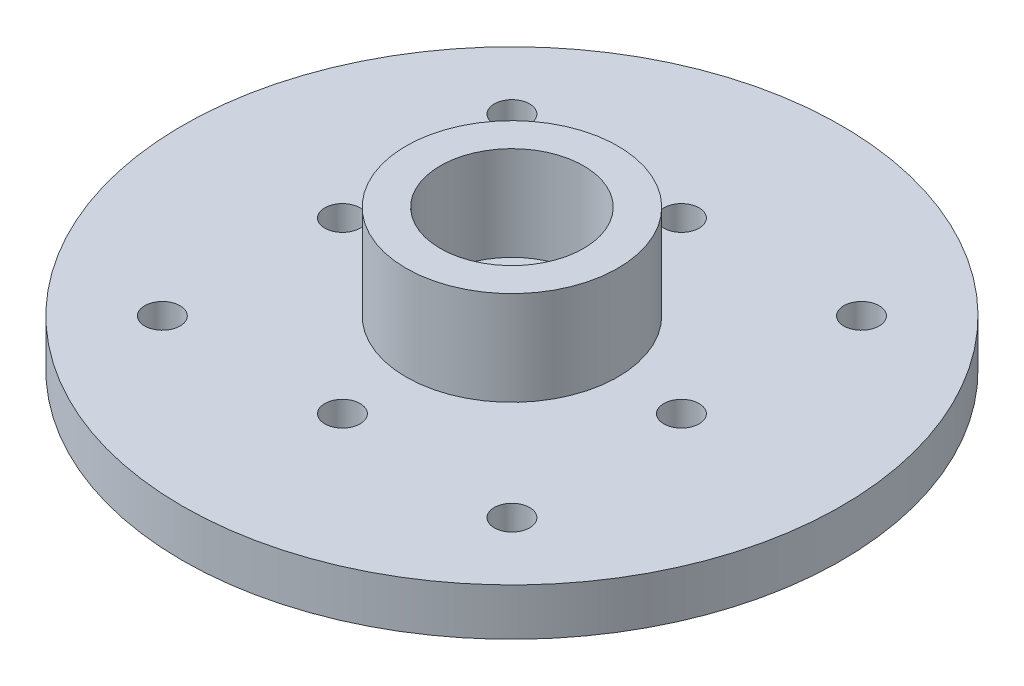
ISO-10303-21;
HEADER;
FILE_DESCRIPTION(('STEP AP214'),'2;1');
FILE_NAME('part.step','',(''),(''),'','','');
FILE_SCHEMA(('AUTOMOTIVE_DESIGN { 1 0 10303 214 1 1 1 1 }'));
ENDSEC;
DATA;
#1=APPLICATION_CONTEXT('core data for automotive mechanical design processes');
#2=APPLICATION_PROTOCOL_DEFINITION('international standard','automotive_design',2000,#1);
#3=PRODUCT_CONTEXT('',#1,'mechanical');
#4=PRODUCT('Part','Part','',(#3));
#5=PRODUCT_RELATED_PRODUCT_CATEGORY('part','',(#4));
#6=PRODUCT_DEFINITION_FORMATION('','',#4);
#7=PRODUCT_DEFINITION_CONTEXT('part definition',#1,'design');
#8=PRODUCT_DEFINITION('design','',#6,#7);
#9=PRODUCT_DEFINITION_SHAPE('','',#8);
#10=(LENGTH_UNIT() NAMED_UNIT(*) SI_UNIT(.MILLI.,.METRE.));
#11=(NAMED_UNIT(*) PLANE_ANGLE_UNIT() SI_UNIT($,.RADIAN.));
#12=(NAMED_UNIT(*) SI_UNIT($,.STERADIAN.) SOLID_ANGLE_UNIT());
#13=UNCERTAINTY_MEASURE_WITH_UNIT(LENGTH_MEASURE(1.E-05),#10,'distance_accuracy_value','');
#14=(GEOMETRIC_REPRESENTATION_CONTEXT(3) GLOBAL_UNCERTAINTY_ASSIGNED_CONTEXT((#13)) GLOBAL_UNIT_ASSIGNED_CONTEXT((#10,
#11,#12)) REPRESENTATION_CONTEXT('',''));
#15=CARTESIAN_POINT('',(0.,0.,0.));
#16=DIRECTION('',(0.,0.,1.));
#17=DIRECTION('',(1.,0.,0.));
#18=AXIS2_PLACEMENT_3D('',#15,#16,#17);
#19=CARTESIAN_POINT('',(0.,-2.,0.));
#20=DIRECTION('',(0.,1.,0.));
#21=DIRECTION('',(0.,0.,1.));
#22=AXIS2_PLACEMENT_3D('',#19,#20,#21);
#23=CYLINDRICAL_SURFACE('',#22,1.75);
#24=CARTESIAN_POINT('',(0.,2.,0.));
#25=DIRECTION('',(0.,1.,0.));
#26=DIRECTION('',(0.,0.,1.));
#27=AXIS2_PLACEMENT_3D('',#24,#25,#26);
#28=CIRCLE('',#27,1.75);
#29=CARTESIAN_POINT('',(0.,2.,1.75));
#30=VERTEX_POINT('',#29);
#31=EDGE_CURVE('E103',#30,#30,#28,.T.);
#32=ORIENTED_EDGE('',*,*,#31,.T.);
#33=EDGE_LOOP('',(#32));
#34=FACE_BOUND('',#33,.T.);
#35=CARTESIAN_POINT('',(0.,1.4,0.));
#36=DIRECTION('',(0.,-1.,0.));
#37=DIRECTION('',(0.,0.,-1.));
#38=AXIS2_PLACEMENT_3D('',#35,#36,#37);
#39=CIRCLE('',#38,1.75);
#40=CARTESIAN_POINT('',(0.,1.4,-1.75));
#41=VERTEX_POINT('',#40);
#42=EDGE_CURVE('E35',#41,#41,#39,.F.);
#43=ORIENTED_EDGE('',*,*,#42,.F.);
#44=EDGE_LOOP('',(#43));
#45=FACE_BOUND('',#44,.T.);
#46=ADVANCED_FACE('F31',(#34,#45),#23,.F.);
#47=CARTESIAN_POINT('',(0.,2.,0.));
#48=DIRECTION('',(0.,1.,0.));
#49=DIRECTION('',(0.,0.,1.));
#50=AXIS2_PLACEMENT_3D('',#47,#48,#49);
#51=PLANE('',#50);
#52=CARTESIAN_POINT('',(-7.42462120245854,2.,-7.42462120245814));
#53=DIRECTION('',(0.,1.,0.));
#54=DIRECTION('',(0.,0.,1.));
#55=AXIS2_PLACEMENT_3D('',#52,#53,#54);
#56=CIRCLE('',#55,0.750000000000704);
#57=CARTESIAN_POINT('',(-7.42462120245854,2.,-6.67462120245744));
#58=VERTEX_POINT('',#57);
#59=EDGE_CURVE('E85',#58,#58,#56,.T.);
#60=ORIENTED_EDGE('',*,*,#59,.F.);
#61=EDGE_LOOP('',(#60));
#62=FACE_BOUND('',#61,.T.);
#63=CARTESIAN_POINT('',(-7.42462120245794,2.,7.42462120245915));
#64=DIRECTION('',(0.,1.,0.));
#65=DIRECTION('',(0.,0.,1.));
#66=AXIS2_PLACEMENT_3D('',#63,#64,#65);
#67=CIRCLE('',#66,0.750000000000698);
#68=CARTESIAN_POINT('',(-7.42462120245794,2.,8.17462120245985));
#69=VERTEX_POINT('',#68);
#70=EDGE_CURVE('E73',#69,#69,#67,.T.);
#71=ORIENTED_EDGE('',*,*,#70,.F.);
#72=EDGE_LOOP('',(#71));
#73=FACE_BOUND('',#72,.T.);
#74=CARTESIAN_POINT('',(7.42462120245936,2.,7.42462120245856));
#75=DIRECTION('',(0.,1.,0.));
#76=DIRECTION('',(0.,0.,1.));
#77=AXIS2_PLACEMENT_3D('',#74,#75,#76);
#78=CIRCLE('',#77,0.750000000000031);
#79=CARTESIAN_POINT('',(7.42462120245936,2.,8.17462120245859));
#80=VERTEX_POINT('',#79);
#81=EDGE_CURVE('E61',#80,#80,#78,.T.);
#82=ORIENTED_EDGE('',*,*,#81,.F.);
#83=EDGE_LOOP('',(#82));
#84=FACE_BOUND('',#83,.T.);
#85=CARTESIAN_POINT('',(7.42462120245876,2.,-7.42462120245874));
#86=DIRECTION('',(0.,1.,0.));
#87=DIRECTION('',(0.,0.,1.));
#88=AXIS2_PLACEMENT_3D('',#85,#86,#87);
#89=CIRCLE('',#88,0.75);
#90=CARTESIAN_POINT('',(7.42462120245876,2.,-6.67462120245874));
#91=VERTEX_POINT('',#90);
#92=EDGE_CURVE('E49',#91,#91,#89,.T.);
#93=ORIENTED_EDGE('',*,*,#92,.F.);
#94=EDGE_LOOP('',(#93));
#95=FACE_BOUND('',#94,.T.);
#96=CARTESIAN_POINT('',(0.,2.,0.));
#97=DIRECTION('',(0.,1.,0.));
#98=DIRECTION('',(0.,0.,1.));
#99=AXIS2_PLACEMENT_3D('',#96,#97,#98);
#100=CIRCLE('',#99,14.);
#101=CARTESIAN_POINT('',(0.,2.,14.));
#102=VERTEX_POINT('',#101);
#103=EDGE_CURVE('E10',#102,#102,#100,.T.);
#104=ORIENTED_EDGE('',*,*,#103,.T.);
#105=EDGE_LOOP('',(#104));
#106=FACE_BOUND('',#105,.T.);
#107=CARTESIAN_POINT('',(0.,2.,-7.2));
#108=DIRECTION('',(0.,1.,0.));
#109=DIRECTION('',(0.,0.,1.));
#110=AXIS2_PLACEMENT_3D('',#107,#108,#109);
#111=CIRCLE('',#110,0.75);
#112=CARTESIAN_POINT('',(0.,2.,-6.45));
#113=VERTEX_POINT('',#112);
#114=EDGE_CURVE('E44',#113,#113,#111,.T.);
#115=ORIENTED_EDGE('',*,*,#114,.F.);
#116=EDGE_LOOP('',(#115));
#117=FACE_BOUND('',#116,.T.);
#118=CARTESIAN_POINT('',(7.20000000000062,2.,-2.01326606492842E-13));
#119=DIRECTION('',(0.,1.,0.));
#120=DIRECTION('',(0.,0.,1.));
#121=AXIS2_PLACEMENT_3D('',#118,#119,#120);
#122=CIRCLE('',#121,0.750000000000036);
#123=CARTESIAN_POINT('',(7.20000000000062,2.,0.749999999999834));
#124=VERTEX_POINT('',#123);
#125=EDGE_CURVE('E55',#124,#124,#122,.T.);
#126=ORIENTED_EDGE('',*,*,#125,.F.);
#127=EDGE_LOOP('',(#126));
#128=FACE_BOUND('',#127,.T.);
#129=CARTESIAN_POINT('',(8.18986847220117E-13,2.,7.20000000000042));
#130=DIRECTION('',(0.,1.,0.));
#131=DIRECTION('',(0.,0.,1.));
#132=AXIS2_PLACEMENT_3D('',#129,#130,#131);
#133=CIRCLE('',#132,0.75);
#134=CARTESIAN_POINT('',(8.18986847220117E-13,2.,7.95000000000042));
#135=VERTEX_POINT('',#134);
#136=EDGE_CURVE('E67',#135,#135,#133,.T.);
#137=ORIENTED_EDGE('',*,*,#136,.F.);
#138=EDGE_LOOP('',(#137));
#139=FACE_BOUND('',#138,.T.);
#140=CARTESIAN_POINT('',(-7.1999999999998,2.,6.18541986422661E-13));
#141=DIRECTION('',(0.,1.,0.));
#142=DIRECTION('',(0.,0.,1.));
#143=AXIS2_PLACEMENT_3D('',#140,#141,#142);
#144=CIRCLE('',#143,0.75);
#145=CARTESIAN_POINT('',(-7.1999999999998,2.,0.750000000000619));
#146=VERTEX_POINT('',#145);
#147=EDGE_CURVE('E79',#146,#146,#144,.T.);
#148=ORIENTED_EDGE('',*,*,#147,.F.);
#149=EDGE_LOOP('',(#148));
#150=FACE_BOUND('',#149,.T.);
#151=CARTESIAN_POINT('',(0.,2.,0.));
#152=DIRECTION('',(0.,1.,0.));
#153=DIRECTION('',(0.,0.,1.));
#154=AXIS2_PLACEMENT_3D('',#151,#152,#153);
#155=CIRCLE('',#154,4.5);
#156=CARTESIAN_POINT('',(0.,2.,4.5));
#157=VERTEX_POINT('',#156);
#158=EDGE_CURVE('E94',#157,#157,#155,.T.);
#159=ORIENTED_EDGE('',*,*,#158,.F.);
#160=EDGE_LOOP('',(#159));
#161=FACE_BOUND('',#160,.T.);
#162=ADVANCED_FACE('F121',(#62,#73,#84,#95,#106,#117,#128,#139,#150,#161),#51,.T.);
#163=CARTESIAN_POINT('',(0.,0.,0.));
#164=DIRECTION('',(0.,1.,0.));
#165=DIRECTION('',(0.,0.,1.));
#166=AXIS2_PLACEMENT_3D('',#163,#164,#165);
#167=PLANE('',#166);
#168=CARTESIAN_POINT('',(0.,0.,0.));
#169=DIRECTION('',(0.,-1.,0.));
#170=DIRECTION('',(0.,0.,-1.));
#171=AXIS2_PLACEMENT_3D('',#168,#169,#170);
#172=CIRCLE('',#171,3.5);
#173=CARTESIAN_POINT('',(0.,0.,-3.5));
#174=VERTEX_POINT('',#173);
#175=EDGE_CURVE('E108',#174,#174,#172,.T.);
#176=ORIENTED_EDGE('',*,*,#175,.F.);
#177=EDGE_LOOP('',(#176));
#178=FACE_BOUND('',#177,.T.);
#179=CARTESIAN_POINT('',(-7.1999999999998,0.,6.18541986422661E-13));
#180=DIRECTION('',(0.,1.,0.));
#181=DIRECTION('',(0.,0.,1.));
#182=AXIS2_PLACEMENT_3D('',#179,#180,#181);
#183=CIRCLE('',#182,0.75);
#184=CARTESIAN_POINT('',(-7.1999999999998,0.,0.750000000000619));
#185=VERTEX_POINT('',#184);
#186=EDGE_CURVE('E82',#185,#185,#183,.T.);
#187=ORIENTED_EDGE('',*,*,#186,.T.);
#188=EDGE_LOOP('',(#187));
#189=FACE_BOUND('',#188,.T.);
#190=CARTESIAN_POINT('',(8.18986847220117E-13,0.,7.20000000000042));
#191=DIRECTION('',(0.,1.,0.));
#192=DIRECTION('',(0.,0.,1.));
#193=AXIS2_PLACEMENT_3D('',#190,#191,#192);
#194=CIRCLE('',#193,0.75);
#195=CARTESIAN_POINT('',(8.18986847220117E-13,0.,7.95000000000042));
#196=VERTEX_POINT('',#195);
#197=EDGE_CURVE('E70',#196,#196,#194,.T.);
#198=ORIENTED_EDGE('',*,*,#197,.T.);
#199=EDGE_LOOP('',(#198));
#200=FACE_BOUND('',#199,.T.);
#201=CARTESIAN_POINT('',(7.20000000000062,0.,-2.01326606492842E-13));
#202=DIRECTION('',(0.,1.,0.));
#203=DIRECTION('',(0.,0.,1.));
#204=AXIS2_PLACEMENT_3D('',#201,#202,#203);
#205=CIRCLE('',#204,0.750000000000036);
#206=CARTESIAN_POINT('',(7.20000000000062,0.,0.749999999999834));
#207=VERTEX_POINT('',#206);
#208=EDGE_CURVE('E58',#207,#207,#205,.T.);
#209=ORIENTED_EDGE('',*,*,#208,.T.);
#210=EDGE_LOOP('',(#209));
#211=FACE_BOUND('',#210,.T.);
#212=CARTESIAN_POINT('',(0.,0.,-7.2));
#213=DIRECTION('',(0.,1.,0.));
#214=DIRECTION('',(0.,0.,1.));
#215=AXIS2_PLACEMENT_3D('',#212,#213,#214);
#216=CIRCLE('',#215,0.75);
#217=CARTESIAN_POINT('',(0.,0.,-6.45));
#218=VERTEX_POINT('',#217);
#219=EDGE_CURVE('E46',#218,#218,#216,.T.);
#220=ORIENTED_EDGE('',*,*,#219,.T.);
#221=EDGE_LOOP('',(#220));
#222=FACE_BOUND('',#221,.T.);
#223=CARTESIAN_POINT('',(0.,0.,0.));
#224=DIRECTION('',(0.,1.,0.));
#225=DIRECTION('',(0.,0.,1.));
#226=AXIS2_PLACEMENT_3D('',#223,#224,#225);
#227=CIRCLE('',#226,14.);
#228=CARTESIAN_POINT('',(0.,0.,14.));
#229=VERTEX_POINT('',#228);
#230=EDGE_CURVE('E39',#229,#229,#227,.T.);
#231=ORIENTED_EDGE('',*,*,#230,.F.);
#232=EDGE_LOOP('',(#231));
#233=FACE_BOUND('',#232,.T.);
#234=CARTESIAN_POINT('',(7.42462120245876,0.,-7.42462120245874));
#235=DIRECTION('',(0.,1.,0.));
#236=DIRECTION('',(0.,0.,1.));
#237=AXIS2_PLACEMENT_3D('',#234,#235,#236);
#238=CIRCLE('',#237,0.75);
#239=CARTESIAN_POINT('',(7.42462120245876,0.,-6.67462120245874));
#240=VERTEX_POINT('',#239);
#241=EDGE_CURVE('E52',#240,#240,#238,.T.);
#242=ORIENTED_EDGE('',*,*,#241,.T.);
#243=EDGE_LOOP('',(#242));
#244=FACE_BOUND('',#243,.T.);
#245=CARTESIAN_POINT('',(7.42462120245936,0.,7.42462120245856));
#246=DIRECTION('',(0.,1.,0.));
#247=DIRECTION('',(0.,0.,1.));
#248=AXIS2_PLACEMENT_3D('',#245,#246,#247);
#249=CIRCLE('',#248,0.750000000000031);
#250=CARTESIAN_POINT('',(7.42462120245936,0.,8.17462120245859));
#251=VERTEX_POINT('',#250);
#252=EDGE_CURVE('E64',#251,#251,#249,.T.);
#253=ORIENTED_EDGE('',*,*,#252,.T.);
#254=EDGE_LOOP('',(#253));
#255=FACE_BOUND('',#254,.T.);
#256=CARTESIAN_POINT('',(-7.42462120245794,0.,7.42462120245915));
#257=DIRECTION('',(0.,1.,0.));
#258=DIRECTION('',(0.,0.,1.));
#259=AXIS2_PLACEMENT_3D('',#256,#257,#258);
#260=CIRCLE('',#259,0.750000000000698);
#261=CARTESIAN_POINT('',(-7.42462120245794,0.,8.17462120245985));
#262=VERTEX_POINT('',#261);
#263=EDGE_CURVE('E76',#262,#262,#260,.T.);
#264=ORIENTED_EDGE('',*,*,#263,.T.);
#265=EDGE_LOOP('',(#264));
#266=FACE_BOUND('',#265,.T.);
#267=CARTESIAN_POINT('',(-7.42462120245854,0.,-7.42462120245814));
#268=DIRECTION('',(0.,1.,0.));
#269=DIRECTION('',(0.,0.,1.));
#270=AXIS2_PLACEMENT_3D('',#267,#268,#269);
#271=CIRCLE('',#270,0.750000000000704);
#272=CARTESIAN_POINT('',(-7.42462120245854,0.,-6.67462120245744));
#273=VERTEX_POINT('',#272);
#274=EDGE_CURVE('E88',#273,#273,#271,.T.);
#275=ORIENTED_EDGE('',*,*,#274,.T.);
#276=EDGE_LOOP('',(#275));
#277=FACE_BOUND('',#276,.T.);
#278=ADVANCED_FACE('F127',(#178,#189,#200,#211,#222,#233,#244,#255,#266,#277),#167,.F.);
#279=CARTESIAN_POINT('',(0.,2.,0.));
#280=DIRECTION('',(0.,-1.,0.));
#281=DIRECTION('',(0.,0.,-1.));
#282=AXIS2_PLACEMENT_3D('',#279,#280,#281);
#283=CYLINDRICAL_SURFACE('',#282,14.);
#284=ORIENTED_EDGE('',*,*,#103,.F.);
#285=EDGE_LOOP('',(#284));
#286=FACE_BOUND('',#285,.T.);
#287=ORIENTED_EDGE('',*,*,#230,.T.);
#288=EDGE_LOOP('',(#287));
#289=FACE_BOUND('',#288,.T.);
#290=ADVANCED_FACE('F33',(#286,#289),#283,.T.);
#291=CARTESIAN_POINT('',(0.,2.,-7.2));
#292=DIRECTION('',(0.,-1.,0.));
#293=DIRECTION('',(0.,0.,-1.));
#294=AXIS2_PLACEMENT_3D('',#291,#292,#293);
#295=CYLINDRICAL_SURFACE('',#294,0.75);
#296=ORIENTED_EDGE('',*,*,#114,.T.);
#297=EDGE_LOOP('',(#296));
#298=FACE_BOUND('',#297,.T.);
#299=ORIENTED_EDGE('',*,*,#219,.F.);
#300=EDGE_LOOP('',(#299));
#301=FACE_BOUND('',#300,.T.);
#302=ADVANCED_FACE('F177',(#298,#301),#295,.F.);
#303=CARTESIAN_POINT('',(7.42462120245876,2.,-7.42462120245874));
#304=DIRECTION('',(0.,-1.,0.));
#305=DIRECTION('',(0.,0.,-1.));
#306=AXIS2_PLACEMENT_3D('',#303,#304,#305);
#307=CYLINDRICAL_SURFACE('',#306,0.75);
#308=ORIENTED_EDGE('',*,*,#92,.T.);
#309=EDGE_LOOP('',(#308));
#310=FACE_BOUND('',#309,.T.);
#311=ORIENTED_EDGE('',*,*,#241,.F.);
#312=EDGE_LOOP('',(#311));
#313=FACE_BOUND('',#312,.T.);
#314=ADVANCED_FACE('F173',(#310,#313),#307,.F.);
#315=CARTESIAN_POINT('',(7.20000000000062,2.,-2.01326606492842E-13));
#316=DIRECTION('',(0.,-1.,0.));
#317=DIRECTION('',(0.,0.,-1.));
#318=AXIS2_PLACEMENT_3D('',#315,#316,#317);
#319=CYLINDRICAL_SURFACE('',#318,0.750000000000036);
#320=ORIENTED_EDGE('',*,*,#125,.T.);
#321=EDGE_LOOP('',(#320));
#322=FACE_BOUND('',#321,.T.);
#323=ORIENTED_EDGE('',*,*,#208,.F.);
#324=EDGE_LOOP('',(#323));
#325=FACE_BOUND('',#324,.T.);
#326=ADVANCED_FACE('F169',(#322,#325),#319,.F.);
#327=CARTESIAN_POINT('',(7.42462120245936,2.,7.42462120245856));
#328=DIRECTION('',(0.,-1.,0.));
#329=DIRECTION('',(0.,0.,-1.));
#330=AXIS2_PLACEMENT_3D('',#327,#328,#329);
#331=CYLINDRICAL_SURFACE('',#330,0.750000000000031);
#332=ORIENTED_EDGE('',*,*,#81,.T.);
#333=EDGE_LOOP('',(#332));
#334=FACE_BOUND('',#333,.T.);
#335=ORIENTED_EDGE('',*,*,#252,.F.);
#336=EDGE_LOOP('',(#335));
#337=FACE_BOUND('',#336,.T.);
#338=ADVANCED_FACE('F165',(#334,#337),#331,.F.);
#339=CARTESIAN_POINT('',(8.18986847220117E-13,2.,7.20000000000042));
#340=DIRECTION('',(0.,-1.,0.));
#341=DIRECTION('',(0.,0.,-1.));
#342=AXIS2_PLACEMENT_3D('',#339,#340,#341);
#343=CYLINDRICAL_SURFACE('',#342,0.75);
#344=ORIENTED_EDGE('',*,*,#136,.T.);
#345=EDGE_LOOP('',(#344));
#346=FACE_BOUND('',#345,.T.);
#347=ORIENTED_EDGE('',*,*,#197,.F.);
#348=EDGE_LOOP('',(#347));
#349=FACE_BOUND('',#348,.T.);
#350=ADVANCED_FACE('F161',(#346,#349),#343,.F.);
#351=CARTESIAN_POINT('',(-7.42462120245794,2.,7.42462120245915));
#352=DIRECTION('',(0.,-1.,0.));
#353=DIRECTION('',(0.,0.,-1.));
#354=AXIS2_PLACEMENT_3D('',#351,#352,#353);
#355=CYLINDRICAL_SURFACE('',#354,0.750000000000698);
#356=ORIENTED_EDGE('',*,*,#70,.T.);
#357=EDGE_LOOP('',(#356));
#358=FACE_BOUND('',#357,.T.);
#359=ORIENTED_EDGE('',*,*,#263,.F.);
#360=EDGE_LOOP('',(#359));
#361=FACE_BOUND('',#360,.T.);
#362=ADVANCED_FACE('F157',(#358,#361),#355,.F.);
#363=CARTESIAN_POINT('',(-7.1999999999998,2.,6.18541986422661E-13));
#364=DIRECTION('',(0.,-1.,0.));
#365=DIRECTION('',(0.,0.,-1.));
#366=AXIS2_PLACEMENT_3D('',#363,#364,#365);
#367=CYLINDRICAL_SURFACE('',#366,0.75);
#368=ORIENTED_EDGE('',*,*,#147,.T.);
#369=EDGE_LOOP('',(#368));
#370=FACE_BOUND('',#369,.T.);
#371=ORIENTED_EDGE('',*,*,#186,.F.);
#372=EDGE_LOOP('',(#371));
#373=FACE_BOUND('',#372,.T.);
#374=ADVANCED_FACE('F153',(#370,#373),#367,.F.);
#375=CARTESIAN_POINT('',(-7.42462120245854,2.,-7.42462120245814));
#376=DIRECTION('',(0.,-1.,0.));
#377=DIRECTION('',(0.,0.,-1.));
#378=AXIS2_PLACEMENT_3D('',#375,#376,#377);
#379=CYLINDRICAL_SURFACE('',#378,0.750000000000704);
#380=ORIENTED_EDGE('',*,*,#59,.T.);
#381=EDGE_LOOP('',(#380));
#382=FACE_BOUND('',#381,.T.);
#383=ORIENTED_EDGE('',*,*,#274,.F.);
#384=EDGE_LOOP('',(#383));
#385=FACE_BOUND('',#384,.T.);
#386=ADVANCED_FACE('F149',(#382,#385),#379,.F.);
#387=CARTESIAN_POINT('',(0.,6.,0.));
#388=DIRECTION('',(0.,-1.,0.));
#389=DIRECTION('',(0.,0.,-1.));
#390=AXIS2_PLACEMENT_3D('',#387,#388,#389);
#391=CYLINDRICAL_SURFACE('',#390,4.5);
#392=CARTESIAN_POINT('',(0.,6.,0.));
#393=DIRECTION('',(0.,1.,0.));
#394=DIRECTION('',(0.,0.,1.));
#395=AXIS2_PLACEMENT_3D('',#392,#393,#394);
#396=CIRCLE('',#395,4.5);
#397=CARTESIAN_POINT('',(0.,6.,4.5));
#398=VERTEX_POINT('',#397);
#399=EDGE_CURVE('E91',#398,#398,#396,.T.);
#400=ORIENTED_EDGE('',*,*,#399,.F.);
#401=EDGE_LOOP('',(#400));
#402=FACE_BOUND('',#401,.T.);
#403=ORIENTED_EDGE('',*,*,#158,.T.);
#404=EDGE_LOOP('',(#403));
#405=FACE_BOUND('',#404,.T.);
#406=ADVANCED_FACE('F145',(#402,#405),#391,.T.);
#407=CARTESIAN_POINT('',(0.,6.,0.));
#408=DIRECTION('',(0.,1.,0.));
#409=DIRECTION('',(0.,0.,1.));
#410=AXIS2_PLACEMENT_3D('',#407,#408,#409);
#411=PLANE('',#410);
#412=CARTESIAN_POINT('',(0.,6.,0.));
#413=DIRECTION('',(0.,1.,0.));
#414=DIRECTION('',(0.,0.,1.));
#415=AXIS2_PLACEMENT_3D('',#412,#413,#414);
#416=CIRCLE('',#415,3.04359167451062);
#417=CARTESIAN_POINT('',(0.,6.,3.04359167451062));
#418=VERTEX_POINT('',#417);
#419=EDGE_CURVE('E100',#418,#418,#416,.T.);
#420=ORIENTED_EDGE('',*,*,#419,.F.);
#421=EDGE_LOOP('',(#420));
#422=FACE_BOUND('',#421,.T.);
#423=ORIENTED_EDGE('',*,*,#399,.T.);
#424=EDGE_LOOP('',(#423));
#425=FACE_BOUND('',#424,.T.);
#426=ADVANCED_FACE('F141',(#422,#425),#411,.T.);
#427=CARTESIAN_POINT('',(0.,2.,0.));
#428=DIRECTION('',(0.,1.,0.));
#429=DIRECTION('',(0.,0.,1.));
#430=AXIS2_PLACEMENT_3D('',#427,#428,#429);
#431=CYLINDRICAL_SURFACE('',#430,3.04359167451062);
#432=CARTESIAN_POINT('',(0.,2.,0.));
#433=DIRECTION('',(0.,1.,0.));
#434=DIRECTION('',(0.,0.,1.));
#435=AXIS2_PLACEMENT_3D('',#432,#433,#434);
#436=CIRCLE('',#435,3.04359167451062);
#437=CARTESIAN_POINT('',(0.,2.,3.04359167451062));
#438=VERTEX_POINT('',#437);
#439=EDGE_CURVE('E97',#438,#438,#436,.T.);
#440=ORIENTED_EDGE('',*,*,#439,.F.);
#441=EDGE_LOOP('',(#440));
#442=FACE_BOUND('',#441,.T.);
#443=ORIENTED_EDGE('',*,*,#419,.T.);
#444=EDGE_LOOP('',(#443));
#445=FACE_BOUND('',#444,.T.);
#446=ADVANCED_FACE('F137',(#442,#445),#431,.F.);
#447=CARTESIAN_POINT('',(0.,2.,0.));
#448=DIRECTION('',(0.,1.,0.));
#449=DIRECTION('',(0.,0.,1.));
#450=AXIS2_PLACEMENT_3D('',#447,#448,#449);
#451=PLANE('',#450);
#452=ORIENTED_EDGE('',*,*,#31,.F.);
#453=EDGE_LOOP('',(#452));
#454=FACE_BOUND('',#453,.T.);
#455=ORIENTED_EDGE('',*,*,#439,.T.);
#456=EDGE_LOOP('',(#455));
#457=FACE_BOUND('',#456,.T.);
#458=ADVANCED_FACE('F134',(#454,#457),#451,.T.);
#459=CARTESIAN_POINT('',(0.,1.4,0.));
#460=DIRECTION('',(0.,-1.,0.));
#461=DIRECTION('',(0.,0.,-1.));
#462=AXIS2_PLACEMENT_3D('',#459,#460,#461);
#463=PLANE('',#462);
#464=CARTESIAN_POINT('',(0.,1.4,0.));
#465=DIRECTION('',(0.,-1.,0.));
#466=DIRECTION('',(0.,0.,-1.));
#467=AXIS2_PLACEMENT_3D('',#464,#465,#466);
#468=CIRCLE('',#467,3.5);
#469=CARTESIAN_POINT('',(0.,1.4,-3.5));
#470=VERTEX_POINT('',#469);
#471=EDGE_CURVE('E111',#470,#470,#468,.T.);
#472=ORIENTED_EDGE('',*,*,#471,.T.);
#473=EDGE_LOOP('',(#472));
#474=FACE_BOUND('',#473,.T.);
#475=ORIENTED_EDGE('',*,*,#42,.T.);
#476=EDGE_LOOP('',(#475));
#477=FACE_BOUND('',#476,.T.);
#478=ADVANCED_FACE('F118',(#474,#477),#463,.T.);
#479=CARTESIAN_POINT('',(0.,1.4,0.));
#480=DIRECTION('',(0.,-1.,0.));
#481=DIRECTION('',(0.,0.,-1.));
#482=AXIS2_PLACEMENT_3D('',#479,#480,#481);
#483=CYLINDRICAL_SURFACE('',#482,3.5);
#484=ORIENTED_EDGE('',*,*,#471,.F.);
#485=EDGE_LOOP('',(#484));
#486=FACE_BOUND('',#485,.T.);
#487=ORIENTED_EDGE('',*,*,#175,.T.);
#488=EDGE_LOOP('',(#487));
#489=FACE_BOUND('',#488,.T.);
#490=ADVANCED_FACE('F132',(#486,#489),#483,.F.);
#491=CLOSED_SHELL('',(#46,#162,#278,#290,#302,#314,#326,#338,#350,#362,#374,#386,#406,#426,#446,
#458,#478,#490));
#492=MANIFOLD_SOLID_BREP('B2',#491);
#493=ADVANCED_BREP_SHAPE_REPRESENTATION('',(#18,#492),#14);
#494=SHAPE_DEFINITION_REPRESENTATION(#9,#493);
ENDSEC;
END-ISO-10303-21;
